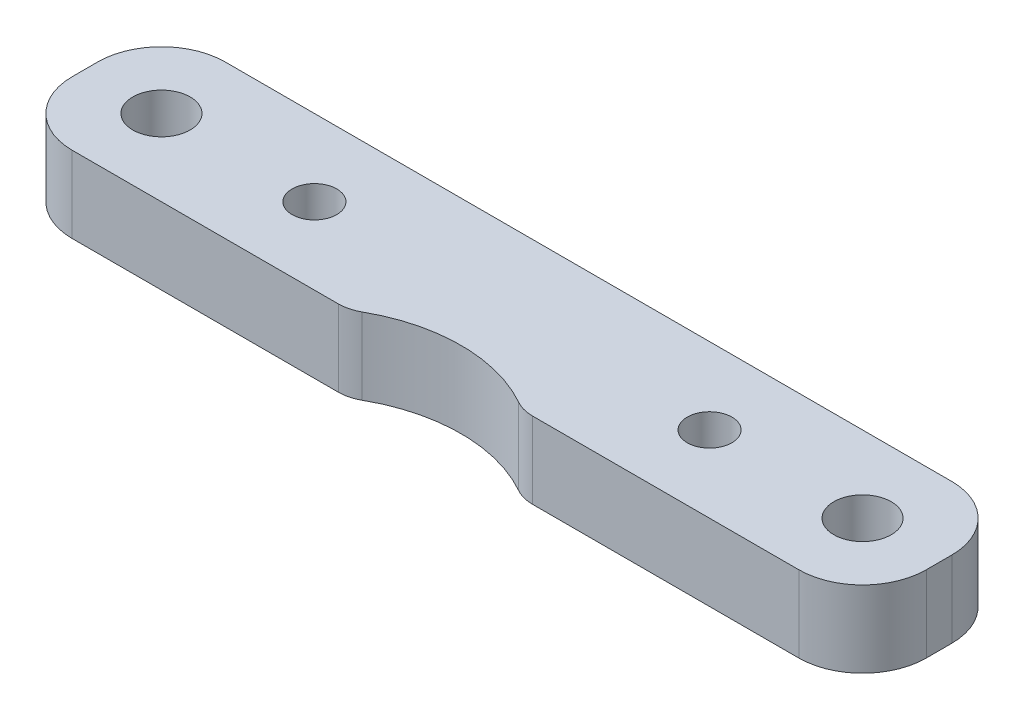
ISO-10303-21;
HEADER;
FILE_DESCRIPTION(('STEP AP214'),'2;1');
FILE_NAME('part.step','',(''),(''),'','','');
FILE_SCHEMA(('AUTOMOTIVE_DESIGN { 1 0 10303 214 1 1 1 1 }'));
ENDSEC;
DATA;
#1=APPLICATION_CONTEXT('core data for automotive mechanical design processes');
#2=APPLICATION_PROTOCOL_DEFINITION('international standard','automotive_design',2000,#1);
#3=PRODUCT_CONTEXT('',#1,'mechanical');
#4=PRODUCT('Part','Part','',(#3));
#5=PRODUCT_RELATED_PRODUCT_CATEGORY('part','',(#4));
#6=PRODUCT_DEFINITION_FORMATION('','',#4);
#7=PRODUCT_DEFINITION_CONTEXT('part definition',#1,'design');
#8=PRODUCT_DEFINITION('design','',#6,#7);
#9=PRODUCT_DEFINITION_SHAPE('','',#8);
#10=(LENGTH_UNIT() NAMED_UNIT(*) SI_UNIT(.MILLI.,.METRE.));
#11=(NAMED_UNIT(*) PLANE_ANGLE_UNIT() SI_UNIT($,.RADIAN.));
#12=(NAMED_UNIT(*) SI_UNIT($,.STERADIAN.) SOLID_ANGLE_UNIT());
#13=UNCERTAINTY_MEASURE_WITH_UNIT(LENGTH_MEASURE(1.E-05),#10,'distance_accuracy_value','');
#14=(GEOMETRIC_REPRESENTATION_CONTEXT(3) GLOBAL_UNCERTAINTY_ASSIGNED_CONTEXT((#13)) GLOBAL_UNIT_ASSIGNED_CONTEXT((#10,
#11,#12)) REPRESENTATION_CONTEXT('',''));
#15=CARTESIAN_POINT('',(0.,0.,0.));
#16=DIRECTION('',(0.,0.,1.));
#17=DIRECTION('',(1.,0.,0.));
#18=AXIS2_PLACEMENT_3D('',#15,#16,#17);
#19=CARTESIAN_POINT('',(28.5,6.,-0.999999999999994));
#20=DIRECTION('',(0.,-1.,0.));
#21=DIRECTION('',(0.,0.,-1.));
#22=AXIS2_PLACEMENT_3D('',#19,#20,#21);
#23=PLANE('',#22);
#24=CARTESIAN_POINT('',(27.5,6.,0.));
#25=DIRECTION('',(0.,1.,0.));
#26=DIRECTION('',(0.,0.,1.));
#27=AXIS2_PLACEMENT_3D('',#24,#25,#26);
#28=CIRCLE('',#27,2.25);
#29=CARTESIAN_POINT('',(27.5,6.,2.25));
#30=VERTEX_POINT('',#29);
#31=EDGE_CURVE('E293',#30,#30,#28,.T.);
#32=ORIENTED_EDGE('',*,*,#31,.F.);
#33=EDGE_LOOP('',(#32));
#34=FACE_BOUND('',#33,.T.);
#35=CARTESIAN_POINT('',(-15.5,6.,0.));
#36=DIRECTION('',(0.,1.,0.));
#37=DIRECTION('',(0.,0.,1.));
#38=AXIS2_PLACEMENT_3D('',#35,#36,#37);
#39=CIRCLE('',#38,1.75);
#40=CARTESIAN_POINT('',(-15.5,6.,1.75));
#41=VERTEX_POINT('',#40);
#42=EDGE_CURVE('E159',#41,#41,#39,.T.);
#43=ORIENTED_EDGE('',*,*,#42,.F.);
#44=EDGE_LOOP('',(#43));
#45=FACE_BOUND('',#44,.T.);
#46=CARTESIAN_POINT('',(28.5,6.,-0.999999999999994));
#47=DIRECTION('',(0.,1.,0.));
#48=DIRECTION('',(0.,0.,-1.));
#49=AXIS2_PLACEMENT_3D('',#46,#47,#48);
#50=CIRCLE('',#49,5.);
#51=CARTESIAN_POINT('',(33.5,6.,-0.999999999999995));
#52=VERTEX_POINT('',#51);
#53=CARTESIAN_POINT('',(28.5,6.,-5.99999999999999));
#54=VERTEX_POINT('',#53);
#55=EDGE_CURVE('E178',#52,#54,#50,.T.);
#56=ORIENTED_EDGE('',*,*,#55,.T.);
#57=DIRECTION('',(-1.,0.,0.));
#58=VECTOR('',#57,1.);
#59=CARTESIAN_POINT('',(-28.5,6.,-5.99999999999999));
#60=LINE('',#59,#58);
#61=CARTESIAN_POINT('',(-28.5,6.,-5.99999999999999));
#62=VERTEX_POINT('',#61);
#63=EDGE_CURVE('E106',#54,#62,#60,.T.);
#64=ORIENTED_EDGE('',*,*,#63,.T.);
#65=CARTESIAN_POINT('',(-28.5,6.,-0.999999999999994));
#66=DIRECTION('',(0.,1.,0.));
#67=DIRECTION('',(0.,0.,1.));
#68=AXIS2_PLACEMENT_3D('',#65,#66,#67);
#69=CIRCLE('',#68,5.);
#70=CARTESIAN_POINT('',(-33.5,6.,-0.999999999999995));
#71=VERTEX_POINT('',#70);
#72=EDGE_CURVE('E205',#62,#71,#69,.T.);
#73=ORIENTED_EDGE('',*,*,#72,.T.);
#74=DIRECTION('',(0.,0.,1.));
#75=VECTOR('',#74,1.);
#76=CARTESIAN_POINT('',(-33.5,6.,-0.999999999999995));
#77=LINE('',#76,#75);
#78=CARTESIAN_POINT('',(-33.5,6.,0.999999999999995));
#79=VERTEX_POINT('',#78);
#80=EDGE_CURVE('E224',#71,#79,#77,.T.);
#81=ORIENTED_EDGE('',*,*,#80,.T.);
#82=CARTESIAN_POINT('',(-28.5,6.,0.999999999999994));
#83=DIRECTION('',(0.,1.,0.));
#84=DIRECTION('',(0.,0.,1.));
#85=AXIS2_PLACEMENT_3D('',#82,#83,#84);
#86=CIRCLE('',#85,5.);
#87=CARTESIAN_POINT('',(-28.5,6.,5.99999999999999));
#88=VERTEX_POINT('',#87);
#89=EDGE_CURVE('E221',#79,#88,#86,.T.);
#90=ORIENTED_EDGE('',*,*,#89,.T.);
#91=DIRECTION('',(1.,0.,0.));
#92=VECTOR('',#91,1.);
#93=CARTESIAN_POINT('',(-28.5,6.,5.99999999999999));
#94=LINE('',#93,#92);
#95=CARTESIAN_POINT('',(-7.6157731058639,6.,6.));
#96=VERTEX_POINT('',#95);
#97=EDGE_CURVE('E223',#88,#96,#94,.T.);
#98=ORIENTED_EDGE('',*,*,#97,.T.);
#99=CARTESIAN_POINT('',(-7.6157731058639,6.,3.));
#100=DIRECTION('',(0.,1.,0.));
#101=DIRECTION('',(0.,0.,-1.));
#102=AXIS2_PLACEMENT_3D('',#99,#100,#101);
#103=CIRCLE('',#102,3.);
#104=CARTESIAN_POINT('',(-6.14175250472895,6.,5.61290322580645));
#105=VERTEX_POINT('',#104);
#106=EDGE_CURVE('E226',#96,#105,#103,.T.);
#107=ORIENTED_EDGE('',*,*,#106,.T.);
#108=CARTESIAN_POINT('',(0.,6.,16.5));
#109=DIRECTION('',(0.,-1.,0.));
#110=DIRECTION('',(0.,0.,1.));
#111=AXIS2_PLACEMENT_3D('',#108,#109,#110);
#112=CIRCLE('',#111,12.5);
#113=CARTESIAN_POINT('',(6.14175250472896,6.,5.61290322580645));
#114=VERTEX_POINT('',#113);
#115=EDGE_CURVE('E232',#105,#114,#112,.T.);
#116=ORIENTED_EDGE('',*,*,#115,.T.);
#117=CARTESIAN_POINT('',(7.61577310586391,6.,3.));
#118=DIRECTION('',(0.,1.,0.));
#119=DIRECTION('',(0.,0.,1.));
#120=AXIS2_PLACEMENT_3D('',#117,#118,#119);
#121=CIRCLE('',#120,3.);
#122=CARTESIAN_POINT('',(7.61577310586391,6.,6.));
#123=VERTEX_POINT('',#122);
#124=EDGE_CURVE('E137',#114,#123,#121,.T.);
#125=ORIENTED_EDGE('',*,*,#124,.T.);
#126=DIRECTION('',(1.,0.,0.));
#127=VECTOR('',#126,1.);
#128=CARTESIAN_POINT('',(7.61577310586391,6.,6.));
#129=LINE('',#128,#127);
#130=CARTESIAN_POINT('',(28.5,6.,5.99999999999999));
#131=VERTEX_POINT('',#130);
#132=EDGE_CURVE('E131',#123,#131,#129,.T.);
#133=ORIENTED_EDGE('',*,*,#132,.T.);
#134=CARTESIAN_POINT('',(28.5,6.,0.999999999999994));
#135=DIRECTION('',(0.,1.,0.));
#136=DIRECTION('',(0.,0.,1.));
#137=AXIS2_PLACEMENT_3D('',#134,#135,#136);
#138=CIRCLE('',#137,5.);
#139=CARTESIAN_POINT('',(33.5,6.,0.999999999999995));
#140=VERTEX_POINT('',#139);
#141=EDGE_CURVE('E135',#131,#140,#138,.T.);
#142=ORIENTED_EDGE('',*,*,#141,.T.);
#143=DIRECTION('',(0.,0.,-1.));
#144=VECTOR('',#143,1.);
#145=CARTESIAN_POINT('',(33.5,6.,-0.999999999999995));
#146=LINE('',#145,#144);
#147=EDGE_CURVE('E51',#140,#52,#146,.T.);
#148=ORIENTED_EDGE('',*,*,#147,.T.);
#149=EDGE_LOOP('',(#56,#64,#73,#81,#90,#98,#107,#116,#125,#133,#142,#148));
#150=FACE_BOUND('',#149,.T.);
#151=CARTESIAN_POINT('',(15.5,6.,0.));
#152=DIRECTION('',(0.,1.,0.));
#153=DIRECTION('',(0.,0.,1.));
#154=AXIS2_PLACEMENT_3D('',#151,#152,#153);
#155=CIRCLE('',#154,1.75);
#156=CARTESIAN_POINT('',(15.5,6.,1.75));
#157=VERTEX_POINT('',#156);
#158=EDGE_CURVE('E299',#157,#157,#155,.T.);
#159=ORIENTED_EDGE('',*,*,#158,.F.);
#160=EDGE_LOOP('',(#159));
#161=FACE_BOUND('',#160,.T.);
#162=CARTESIAN_POINT('',(-27.5,6.,0.));
#163=DIRECTION('',(0.,1.,0.));
#164=DIRECTION('',(0.,0.,1.));
#165=AXIS2_PLACEMENT_3D('',#162,#163,#164);
#166=CIRCLE('',#165,2.25);
#167=CARTESIAN_POINT('',(-27.5,6.,2.25));
#168=VERTEX_POINT('',#167);
#169=EDGE_CURVE('E284',#168,#168,#166,.T.);
#170=ORIENTED_EDGE('',*,*,#169,.F.);
#171=EDGE_LOOP('',(#170));
#172=FACE_BOUND('',#171,.T.);
#173=ADVANCED_FACE('F34',(#34,#45,#150,#161,#172),#23,.F.);
#174=CARTESIAN_POINT('',(28.5,0.,-0.999999999999994));
#175=DIRECTION('',(0.,-1.,0.));
#176=DIRECTION('',(0.,0.,-1.));
#177=AXIS2_PLACEMENT_3D('',#174,#175,#176);
#178=PLANE('',#177);
#179=CARTESIAN_POINT('',(27.5,0.,0.));
#180=DIRECTION('',(0.,1.,0.));
#181=DIRECTION('',(0.,0.,1.));
#182=AXIS2_PLACEMENT_3D('',#179,#180,#181);
#183=CIRCLE('',#182,2.25);
#184=CARTESIAN_POINT('',(27.5,0.,2.25));
#185=VERTEX_POINT('',#184);
#186=EDGE_CURVE('E290',#185,#185,#183,.T.);
#187=ORIENTED_EDGE('',*,*,#186,.T.);
#188=EDGE_LOOP('',(#187));
#189=FACE_BOUND('',#188,.T.);
#190=CARTESIAN_POINT('',(-15.5,0.,0.));
#191=DIRECTION('',(0.,1.,0.));
#192=DIRECTION('',(0.,0.,1.));
#193=AXIS2_PLACEMENT_3D('',#190,#191,#192);
#194=CIRCLE('',#193,1.75);
#195=CARTESIAN_POINT('',(-15.5,0.,1.75));
#196=VERTEX_POINT('',#195);
#197=EDGE_CURVE('E302',#196,#196,#194,.T.);
#198=ORIENTED_EDGE('',*,*,#197,.T.);
#199=EDGE_LOOP('',(#198));
#200=FACE_BOUND('',#199,.T.);
#201=CARTESIAN_POINT('',(28.5,0.,-0.999999999999994));
#202=DIRECTION('',(0.,1.,0.));
#203=DIRECTION('',(0.,0.,-1.));
#204=AXIS2_PLACEMENT_3D('',#201,#202,#203);
#205=CIRCLE('',#204,5.);
#206=CARTESIAN_POINT('',(33.5,0.,-0.999999999999995));
#207=VERTEX_POINT('',#206);
#208=CARTESIAN_POINT('',(28.5,0.,-5.99999999999999));
#209=VERTEX_POINT('',#208);
#210=EDGE_CURVE('E155',#207,#209,#205,.T.);
#211=ORIENTED_EDGE('',*,*,#210,.F.);
#212=DIRECTION('',(0.,0.,-1.));
#213=VECTOR('',#212,1.);
#214=CARTESIAN_POINT('',(33.5,0.,-0.999999999999995));
#215=LINE('',#214,#213);
#216=CARTESIAN_POINT('',(33.5,0.,0.999999999999995));
#217=VERTEX_POINT('',#216);
#218=EDGE_CURVE('E98',#217,#207,#215,.T.);
#219=ORIENTED_EDGE('',*,*,#218,.F.);
#220=CARTESIAN_POINT('',(28.5,0.,0.999999999999994));
#221=DIRECTION('',(0.,1.,0.));
#222=DIRECTION('',(0.,0.,1.));
#223=AXIS2_PLACEMENT_3D('',#220,#221,#222);
#224=CIRCLE('',#223,5.);
#225=CARTESIAN_POINT('',(28.5,0.,5.99999999999999));
#226=VERTEX_POINT('',#225);
#227=EDGE_CURVE('E92',#226,#217,#224,.T.);
#228=ORIENTED_EDGE('',*,*,#227,.F.);
#229=DIRECTION('',(1.,0.,0.));
#230=VECTOR('',#229,1.);
#231=CARTESIAN_POINT('',(7.61577310586391,0.,6.));
#232=LINE('',#231,#230);
#233=CARTESIAN_POINT('',(7.61577310586391,0.,6.));
#234=VERTEX_POINT('',#233);
#235=EDGE_CURVE('E145',#234,#226,#232,.T.);
#236=ORIENTED_EDGE('',*,*,#235,.F.);
#237=CARTESIAN_POINT('',(7.61577310586391,0.,3.));
#238=DIRECTION('',(0.,1.,0.));
#239=DIRECTION('',(0.,0.,1.));
#240=AXIS2_PLACEMENT_3D('',#237,#238,#239);
#241=CIRCLE('',#240,3.);
#242=CARTESIAN_POINT('',(6.14175250472896,0.,5.61290322580645));
#243=VERTEX_POINT('',#242);
#244=EDGE_CURVE('E173',#243,#234,#241,.T.);
#245=ORIENTED_EDGE('',*,*,#244,.F.);
#246=CARTESIAN_POINT('',(0.,0.,16.5));
#247=DIRECTION('',(0.,-1.,0.));
#248=DIRECTION('',(0.,0.,1.));
#249=AXIS2_PLACEMENT_3D('',#246,#247,#248);
#250=CIRCLE('',#249,12.5);
#251=CARTESIAN_POINT('',(-6.14175250472895,0.,5.61290322580645));
#252=VERTEX_POINT('',#251);
#253=EDGE_CURVE('E171',#252,#243,#250,.T.);
#254=ORIENTED_EDGE('',*,*,#253,.F.);
#255=CARTESIAN_POINT('',(-7.6157731058639,0.,3.));
#256=DIRECTION('',(0.,1.,0.));
#257=DIRECTION('',(0.,0.,-1.));
#258=AXIS2_PLACEMENT_3D('',#255,#256,#257);
#259=CIRCLE('',#258,3.);
#260=CARTESIAN_POINT('',(-7.6157731058639,0.,6.));
#261=VERTEX_POINT('',#260);
#262=EDGE_CURVE('E169',#261,#252,#259,.T.);
#263=ORIENTED_EDGE('',*,*,#262,.F.);
#264=DIRECTION('',(1.,0.,0.));
#265=VECTOR('',#264,1.);
#266=CARTESIAN_POINT('',(-28.5,0.,5.99999999999999));
#267=LINE('',#266,#265);
#268=CARTESIAN_POINT('',(-28.5,0.,5.99999999999999));
#269=VERTEX_POINT('',#268);
#270=EDGE_CURVE('E167',#269,#261,#267,.T.);
#271=ORIENTED_EDGE('',*,*,#270,.F.);
#272=CARTESIAN_POINT('',(-28.5,0.,0.999999999999994));
#273=DIRECTION('',(0.,1.,0.));
#274=DIRECTION('',(0.,0.,1.));
#275=AXIS2_PLACEMENT_3D('',#272,#273,#274);
#276=CIRCLE('',#275,5.);
#277=CARTESIAN_POINT('',(-33.5,0.,0.999999999999995));
#278=VERTEX_POINT('',#277);
#279=EDGE_CURVE('E165',#278,#269,#276,.T.);
#280=ORIENTED_EDGE('',*,*,#279,.F.);
#281=DIRECTION('',(0.,0.,1.));
#282=VECTOR('',#281,1.);
#283=CARTESIAN_POINT('',(-33.5,0.,-0.999999999999995));
#284=LINE('',#283,#282);
#285=CARTESIAN_POINT('',(-33.5,0.,-0.999999999999995));
#286=VERTEX_POINT('',#285);
#287=EDGE_CURVE('E163',#286,#278,#284,.T.);
#288=ORIENTED_EDGE('',*,*,#287,.F.);
#289=CARTESIAN_POINT('',(-28.5,0.,-0.999999999999994));
#290=DIRECTION('',(0.,1.,0.));
#291=DIRECTION('',(0.,0.,1.));
#292=AXIS2_PLACEMENT_3D('',#289,#290,#291);
#293=CIRCLE('',#292,5.);
#294=CARTESIAN_POINT('',(-28.5,0.,-5.99999999999999));
#295=VERTEX_POINT('',#294);
#296=EDGE_CURVE('E161',#295,#286,#293,.T.);
#297=ORIENTED_EDGE('',*,*,#296,.F.);
#298=DIRECTION('',(-1.,0.,0.));
#299=VECTOR('',#298,1.);
#300=CARTESIAN_POINT('',(-28.5,0.,-5.99999999999999));
#301=LINE('',#300,#299);
#302=EDGE_CURVE('E158',#209,#295,#301,.T.);
#303=ORIENTED_EDGE('',*,*,#302,.F.);
#304=EDGE_LOOP('',(#211,#219,#228,#236,#245,#254,#263,#271,#280,#288,#297,#303));
#305=FACE_BOUND('',#304,.T.);
#306=CARTESIAN_POINT('',(15.5,0.,0.));
#307=DIRECTION('',(0.,1.,0.));
#308=DIRECTION('',(0.,0.,1.));
#309=AXIS2_PLACEMENT_3D('',#306,#307,#308);
#310=CIRCLE('',#309,1.75);
#311=CARTESIAN_POINT('',(15.5,0.,1.75));
#312=VERTEX_POINT('',#311);
#313=EDGE_CURVE('E296',#312,#312,#310,.T.);
#314=ORIENTED_EDGE('',*,*,#313,.T.);
#315=EDGE_LOOP('',(#314));
#316=FACE_BOUND('',#315,.T.);
#317=CARTESIAN_POINT('',(-27.5,0.,0.));
#318=DIRECTION('',(0.,1.,0.));
#319=DIRECTION('',(0.,0.,1.));
#320=AXIS2_PLACEMENT_3D('',#317,#318,#319);
#321=CIRCLE('',#320,2.25);
#322=CARTESIAN_POINT('',(-27.5,0.,2.25));
#323=VERTEX_POINT('',#322);
#324=EDGE_CURVE('E287',#323,#323,#321,.T.);
#325=ORIENTED_EDGE('',*,*,#324,.T.);
#326=EDGE_LOOP('',(#325));
#327=FACE_BOUND('',#326,.T.);
#328=ADVANCED_FACE('F209',(#189,#200,#305,#316,#327),#178,.T.);
#329=CARTESIAN_POINT('',(28.5,6.,-0.999999999999994));
#330=DIRECTION('',(0.,-1.,0.));
#331=DIRECTION('',(0.,0.,-1.));
#332=AXIS2_PLACEMENT_3D('',#329,#330,#331);
#333=CYLINDRICAL_SURFACE('',#332,5.);
#334=ORIENTED_EDGE('',*,*,#210,.T.);
#335=DIRECTION('',(0.,-1.,0.));
#336=VECTOR('',#335,1.);
#337=CARTESIAN_POINT('',(28.5,6.,-5.99999999999999));
#338=LINE('',#337,#336);
#339=EDGE_CURVE('E11',#54,#209,#338,.T.);
#340=ORIENTED_EDGE('',*,*,#339,.F.);
#341=ORIENTED_EDGE('',*,*,#55,.F.);
#342=DIRECTION('',(0.,-1.,0.));
#343=VECTOR('',#342,1.);
#344=CARTESIAN_POINT('',(33.5,6.,-0.999999999999995));
#345=LINE('',#344,#343);
#346=EDGE_CURVE('E151',#52,#207,#345,.T.);
#347=ORIENTED_EDGE('',*,*,#346,.T.);
#348=EDGE_LOOP('',(#334,#340,#341,#347));
#349=FACE_BOUND('',#348,.T.);
#350=ADVANCED_FACE('F36',(#349),#333,.T.);
#351=CARTESIAN_POINT('',(-28.5,6.,-5.99999999999999));
#352=DIRECTION('',(0.,0.,1.));
#353=DIRECTION('',(1.,0.,0.));
#354=AXIS2_PLACEMENT_3D('',#351,#352,#353);
#355=PLANE('',#354);
#356=ORIENTED_EDGE('',*,*,#302,.T.);
#357=DIRECTION('',(0.,-1.,0.));
#358=VECTOR('',#357,1.);
#359=CARTESIAN_POINT('',(-28.5,6.,-5.99999999999999));
#360=LINE('',#359,#358);
#361=EDGE_CURVE('E43',#62,#295,#360,.T.);
#362=ORIENTED_EDGE('',*,*,#361,.F.);
#363=ORIENTED_EDGE('',*,*,#63,.F.);
#364=ORIENTED_EDGE('',*,*,#339,.T.);
#365=EDGE_LOOP('',(#356,#362,#363,#364));
#366=FACE_BOUND('',#365,.T.);
#367=ADVANCED_FACE('F411',(#366),#355,.F.);
#368=CARTESIAN_POINT('',(-28.5,6.,-0.999999999999994));
#369=DIRECTION('',(0.,-1.,0.));
#370=DIRECTION('',(0.,0.,-1.));
#371=AXIS2_PLACEMENT_3D('',#368,#369,#370);
#372=CYLINDRICAL_SURFACE('',#371,5.);
#373=ORIENTED_EDGE('',*,*,#296,.T.);
#374=DIRECTION('',(0.,-1.,0.));
#375=VECTOR('',#374,1.);
#376=CARTESIAN_POINT('',(-33.5,6.,-0.999999999999995));
#377=LINE('',#376,#375);
#378=EDGE_CURVE('E197',#71,#286,#377,.T.);
#379=ORIENTED_EDGE('',*,*,#378,.F.);
#380=ORIENTED_EDGE('',*,*,#72,.F.);
#381=ORIENTED_EDGE('',*,*,#361,.T.);
#382=EDGE_LOOP('',(#373,#379,#380,#381));
#383=FACE_BOUND('',#382,.T.);
#384=ADVANCED_FACE('F203',(#383),#372,.T.);
#385=CARTESIAN_POINT('',(-33.5,6.,-0.999999999999995));
#386=DIRECTION('',(1.,0.,0.));
#387=DIRECTION('',(0.,0.,-1.));
#388=AXIS2_PLACEMENT_3D('',#385,#386,#387);
#389=PLANE('',#388);
#390=ORIENTED_EDGE('',*,*,#287,.T.);
#391=DIRECTION('',(0.,-1.,0.));
#392=VECTOR('',#391,1.);
#393=CARTESIAN_POINT('',(-33.5,6.,0.999999999999995));
#394=LINE('',#393,#392);
#395=EDGE_CURVE('E194',#79,#278,#394,.T.);
#396=ORIENTED_EDGE('',*,*,#395,.F.);
#397=ORIENTED_EDGE('',*,*,#80,.F.);
#398=ORIENTED_EDGE('',*,*,#378,.T.);
#399=EDGE_LOOP('',(#390,#396,#397,#398));
#400=FACE_BOUND('',#399,.T.);
#401=ADVANCED_FACE('F215',(#400),#389,.F.);
#402=CARTESIAN_POINT('',(-28.5,6.,0.999999999999994));
#403=DIRECTION('',(0.,-1.,0.));
#404=DIRECTION('',(0.,0.,-1.));
#405=AXIS2_PLACEMENT_3D('',#402,#403,#404);
#406=CYLINDRICAL_SURFACE('',#405,5.);
#407=ORIENTED_EDGE('',*,*,#279,.T.);
#408=DIRECTION('',(0.,-1.,0.));
#409=VECTOR('',#408,1.);
#410=CARTESIAN_POINT('',(-28.5,6.,5.99999999999999));
#411=LINE('',#410,#409);
#412=EDGE_CURVE('E191',#88,#269,#411,.T.);
#413=ORIENTED_EDGE('',*,*,#412,.F.);
#414=ORIENTED_EDGE('',*,*,#89,.F.);
#415=ORIENTED_EDGE('',*,*,#395,.T.);
#416=EDGE_LOOP('',(#407,#413,#414,#415));
#417=FACE_BOUND('',#416,.T.);
#418=ADVANCED_FACE('F219',(#417),#406,.T.);
#419=CARTESIAN_POINT('',(-28.5,6.,5.99999999999999));
#420=DIRECTION('',(0.,0.,-1.));
#421=DIRECTION('',(-1.,0.,0.));
#422=AXIS2_PLACEMENT_3D('',#419,#420,#421);
#423=PLANE('',#422);
#424=ORIENTED_EDGE('',*,*,#270,.T.);
#425=DIRECTION('',(0.,-1.,0.));
#426=VECTOR('',#425,1.);
#427=CARTESIAN_POINT('',(-7.6157731058639,6.,6.));
#428=LINE('',#427,#426);
#429=EDGE_CURVE('E188',#96,#261,#428,.T.);
#430=ORIENTED_EDGE('',*,*,#429,.F.);
#431=ORIENTED_EDGE('',*,*,#97,.F.);
#432=ORIENTED_EDGE('',*,*,#412,.T.);
#433=EDGE_LOOP('',(#424,#430,#431,#432));
#434=FACE_BOUND('',#433,.T.);
#435=ADVANCED_FACE('F376',(#434),#423,.F.);
#436=CARTESIAN_POINT('',(-7.6157731058639,6.,3.));
#437=DIRECTION('',(0.,-1.,0.));
#438=DIRECTION('',(0.,0.,-1.));
#439=AXIS2_PLACEMENT_3D('',#436,#437,#438);
#440=CYLINDRICAL_SURFACE('',#439,3.);
#441=ORIENTED_EDGE('',*,*,#262,.T.);
#442=DIRECTION('',(0.,-1.,0.));
#443=VECTOR('',#442,1.);
#444=CARTESIAN_POINT('',(-6.14175250472895,6.,5.61290322580645));
#445=LINE('',#444,#443);
#446=EDGE_CURVE('E185',#105,#252,#445,.T.);
#447=ORIENTED_EDGE('',*,*,#446,.F.);
#448=ORIENTED_EDGE('',*,*,#106,.F.);
#449=ORIENTED_EDGE('',*,*,#429,.T.);
#450=EDGE_LOOP('',(#441,#447,#448,#449));
#451=FACE_BOUND('',#450,.T.);
#452=ADVANCED_FACE('F367',(#451),#440,.T.);
#453=CARTESIAN_POINT('',(0.,6.,16.5));
#454=DIRECTION('',(0.,-1.,0.));
#455=DIRECTION('',(0.,0.,-1.));
#456=AXIS2_PLACEMENT_3D('',#453,#454,#455);
#457=CYLINDRICAL_SURFACE('',#456,12.5);
#458=ORIENTED_EDGE('',*,*,#253,.T.);
#459=DIRECTION('',(0.,-1.,0.));
#460=VECTOR('',#459,1.);
#461=CARTESIAN_POINT('',(6.14175250472896,6.,5.61290322580645));
#462=LINE('',#461,#460);
#463=EDGE_CURVE('E182',#114,#243,#462,.T.);
#464=ORIENTED_EDGE('',*,*,#463,.F.);
#465=ORIENTED_EDGE('',*,*,#115,.F.);
#466=ORIENTED_EDGE('',*,*,#446,.T.);
#467=EDGE_LOOP('',(#458,#464,#465,#466));
#468=FACE_BOUND('',#467,.T.);
#469=ADVANCED_FACE('F238',(#468),#457,.F.);
#470=CARTESIAN_POINT('',(7.61577310586391,6.,3.));
#471=DIRECTION('',(0.,-1.,0.));
#472=DIRECTION('',(0.,0.,-1.));
#473=AXIS2_PLACEMENT_3D('',#470,#471,#472);
#474=CYLINDRICAL_SURFACE('',#473,3.);
#475=ORIENTED_EDGE('',*,*,#244,.T.);
#476=DIRECTION('',(0.,-1.,0.));
#477=VECTOR('',#476,1.);
#478=CARTESIAN_POINT('',(7.61577310586391,6.,6.));
#479=LINE('',#478,#477);
#480=EDGE_CURVE('E146',#123,#234,#479,.T.);
#481=ORIENTED_EDGE('',*,*,#480,.F.);
#482=ORIENTED_EDGE('',*,*,#124,.F.);
#483=ORIENTED_EDGE('',*,*,#463,.T.);
#484=EDGE_LOOP('',(#475,#481,#482,#483));
#485=FACE_BOUND('',#484,.T.);
#486=ADVANCED_FACE('F242',(#485),#474,.T.);
#487=CARTESIAN_POINT('',(7.61577310586391,6.,6.));
#488=DIRECTION('',(0.,0.,-1.));
#489=DIRECTION('',(-1.,0.,0.));
#490=AXIS2_PLACEMENT_3D('',#487,#488,#489);
#491=PLANE('',#490);
#492=ORIENTED_EDGE('',*,*,#235,.T.);
#493=DIRECTION('',(0.,-1.,0.));
#494=VECTOR('',#493,1.);
#495=CARTESIAN_POINT('',(28.5,6.,5.99999999999999));
#496=LINE('',#495,#494);
#497=EDGE_CURVE('E142',#131,#226,#496,.T.);
#498=ORIENTED_EDGE('',*,*,#497,.F.);
#499=ORIENTED_EDGE('',*,*,#132,.F.);
#500=ORIENTED_EDGE('',*,*,#480,.T.);
#501=EDGE_LOOP('',(#492,#498,#499,#500));
#502=FACE_BOUND('',#501,.T.);
#503=ADVANCED_FACE('F143',(#502),#491,.F.);
#504=CARTESIAN_POINT('',(28.5,6.,0.999999999999994));
#505=DIRECTION('',(0.,-1.,0.));
#506=DIRECTION('',(0.,0.,-1.));
#507=AXIS2_PLACEMENT_3D('',#504,#505,#506);
#508=CYLINDRICAL_SURFACE('',#507,5.);
#509=ORIENTED_EDGE('',*,*,#227,.T.);
#510=DIRECTION('',(0.,-1.,0.));
#511=VECTOR('',#510,1.);
#512=CARTESIAN_POINT('',(33.5,6.,0.999999999999995));
#513=LINE('',#512,#511);
#514=EDGE_CURVE('E147',#140,#217,#513,.T.);
#515=ORIENTED_EDGE('',*,*,#514,.F.);
#516=ORIENTED_EDGE('',*,*,#141,.F.);
#517=ORIENTED_EDGE('',*,*,#497,.T.);
#518=EDGE_LOOP('',(#509,#515,#516,#517));
#519=FACE_BOUND('',#518,.T.);
#520=ADVANCED_FACE('F149',(#519),#508,.T.);
#521=CARTESIAN_POINT('',(33.5,6.,-0.999999999999995));
#522=DIRECTION('',(-1.,0.,0.));
#523=DIRECTION('',(0.,0.,1.));
#524=AXIS2_PLACEMENT_3D('',#521,#522,#523);
#525=PLANE('',#524);
#526=ORIENTED_EDGE('',*,*,#218,.T.);
#527=ORIENTED_EDGE('',*,*,#346,.F.);
#528=ORIENTED_EDGE('',*,*,#147,.F.);
#529=ORIENTED_EDGE('',*,*,#514,.T.);
#530=EDGE_LOOP('',(#526,#527,#528,#529));
#531=FACE_BOUND('',#530,.T.);
#532=ADVANCED_FACE('F246',(#531),#525,.F.);
#533=CARTESIAN_POINT('',(-15.5,6.,0.));
#534=DIRECTION('',(0.,-1.,0.));
#535=DIRECTION('',(0.,0.,-1.));
#536=AXIS2_PLACEMENT_3D('',#533,#534,#535);
#537=CYLINDRICAL_SURFACE('',#536,1.75);
#538=ORIENTED_EDGE('',*,*,#42,.T.);
#539=EDGE_LOOP('',(#538));
#540=FACE_BOUND('',#539,.T.);
#541=ORIENTED_EDGE('',*,*,#197,.F.);
#542=EDGE_LOOP('',(#541));
#543=FACE_BOUND('',#542,.T.);
#544=ADVANCED_FACE('F248',(#540,#543),#537,.F.);
#545=CARTESIAN_POINT('',(15.5,6.,0.));
#546=DIRECTION('',(0.,-1.,0.));
#547=DIRECTION('',(0.,0.,-1.));
#548=AXIS2_PLACEMENT_3D('',#545,#546,#547);
#549=CYLINDRICAL_SURFACE('',#548,1.75);
#550=ORIENTED_EDGE('',*,*,#158,.T.);
#551=EDGE_LOOP('',(#550));
#552=FACE_BOUND('',#551,.T.);
#553=ORIENTED_EDGE('',*,*,#313,.F.);
#554=EDGE_LOOP('',(#553));
#555=FACE_BOUND('',#554,.T.);
#556=ADVANCED_FACE('F254',(#552,#555),#549,.F.);
#557=CARTESIAN_POINT('',(27.5,6.,0.));
#558=DIRECTION('',(0.,-1.,0.));
#559=DIRECTION('',(0.,0.,-1.));
#560=AXIS2_PLACEMENT_3D('',#557,#558,#559);
#561=CYLINDRICAL_SURFACE('',#560,2.25);
#562=ORIENTED_EDGE('',*,*,#31,.T.);
#563=EDGE_LOOP('',(#562));
#564=FACE_BOUND('',#563,.T.);
#565=ORIENTED_EDGE('',*,*,#186,.F.);
#566=EDGE_LOOP('',(#565));
#567=FACE_BOUND('',#566,.T.);
#568=ADVANCED_FACE('F271',(#564,#567),#561,.F.);
#569=CARTESIAN_POINT('',(-27.5,6.,0.));
#570=DIRECTION('',(0.,-1.,0.));
#571=DIRECTION('',(0.,0.,-1.));
#572=AXIS2_PLACEMENT_3D('',#569,#570,#571);
#573=CYLINDRICAL_SURFACE('',#572,2.25);
#574=ORIENTED_EDGE('',*,*,#169,.T.);
#575=EDGE_LOOP('',(#574));
#576=FACE_BOUND('',#575,.T.);
#577=ORIENTED_EDGE('',*,*,#324,.F.);
#578=EDGE_LOOP('',(#577));
#579=FACE_BOUND('',#578,.T.);
#580=ADVANCED_FACE('F275',(#576,#579),#573,.F.);
#581=CLOSED_SHELL('',(#173,#328,#350,#367,#384,#401,#418,#435,#452,#469,#486,#503,#520,#532,
#544,#556,#568,#580));
#582=MANIFOLD_SOLID_BREP('B2',#581);
#583=ADVANCED_BREP_SHAPE_REPRESENTATION('',(#18,#582),#14);
#584=SHAPE_DEFINITION_REPRESENTATION(#9,#583);
ENDSEC;
END-ISO-10303-21;
